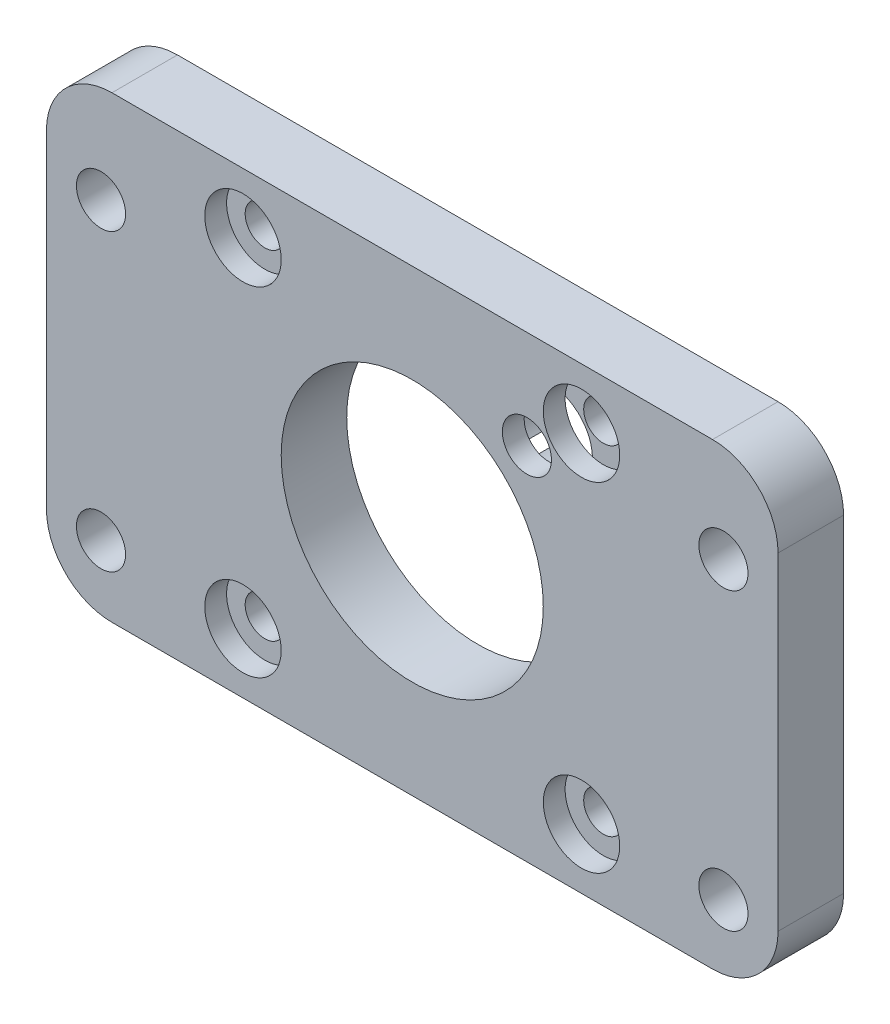
ISO-10303-21;
HEADER;
FILE_DESCRIPTION(('STEP AP214'),'2;1');
FILE_NAME('part.step','',(''),(''),'','','');
FILE_SCHEMA(('AUTOMOTIVE_DESIGN { 1 0 10303 214 1 1 1 1 }'));
ENDSEC;
DATA;
#1=APPLICATION_CONTEXT('core data for automotive mechanical design processes');
#2=APPLICATION_PROTOCOL_DEFINITION('international standard','automotive_design',2000,#1);
#3=PRODUCT_CONTEXT('',#1,'mechanical');
#4=PRODUCT('Part','Part','',(#3));
#5=PRODUCT_RELATED_PRODUCT_CATEGORY('part','',(#4));
#6=PRODUCT_DEFINITION_FORMATION('','',#4);
#7=PRODUCT_DEFINITION_CONTEXT('part definition',#1,'design');
#8=PRODUCT_DEFINITION('design','',#6,#7);
#9=PRODUCT_DEFINITION_SHAPE('','',#8);
#10=(LENGTH_UNIT() NAMED_UNIT(*) SI_UNIT(.MILLI.,.METRE.));
#11=(NAMED_UNIT(*) PLANE_ANGLE_UNIT() SI_UNIT($,.RADIAN.));
#12=(NAMED_UNIT(*) SI_UNIT($,.STERADIAN.) SOLID_ANGLE_UNIT());
#13=UNCERTAINTY_MEASURE_WITH_UNIT(LENGTH_MEASURE(1.E-05),#10,'distance_accuracy_value','');
#14=(GEOMETRIC_REPRESENTATION_CONTEXT(3) GLOBAL_UNCERTAINTY_ASSIGNED_CONTEXT((#13)) GLOBAL_UNIT_ASSIGNED_CONTEXT((#10,
#11,#12)) REPRESENTATION_CONTEXT('',''));
#15=CARTESIAN_POINT('',(0.,0.,0.));
#16=DIRECTION('',(0.,0.,1.));
#17=DIRECTION('',(1.,0.,0.));
#18=AXIS2_PLACEMENT_3D('',#15,#16,#17);
#19=CARTESIAN_POINT('',(49.,36.5,10.));
#20=DIRECTION('',(0.,0.,-1.));
#21=DIRECTION('',(-1.,0.,0.));
#22=AXIS2_PLACEMENT_3D('',#19,#20,#21);
#23=CYLINDRICAL_SURFACE('',#22,1.8);
#24=CARTESIAN_POINT('',(49.,36.5,0.));
#25=DIRECTION('',(0.,0.,-1.));
#26=DIRECTION('',(-1.,0.,0.));
#27=AXIS2_PLACEMENT_3D('',#24,#25,#26);
#28=CIRCLE('',#27,1.8);
#29=CARTESIAN_POINT('',(47.2,36.5,0.));
#30=VERTEX_POINT('',#29);
#31=EDGE_CURVE('E160',#30,#30,#28,.T.);
#32=ORIENTED_EDGE('',*,*,#31,.T.);
#33=EDGE_LOOP('',(#32));
#34=FACE_BOUND('',#33,.T.);
#35=CARTESIAN_POINT('',(49.,36.5,4.));
#36=DIRECTION('',(0.,0.,1.));
#37=DIRECTION('',(1.,0.,0.));
#38=AXIS2_PLACEMENT_3D('',#35,#36,#37);
#39=CIRCLE('',#38,1.8);
#40=CARTESIAN_POINT('',(50.8,36.5,4.));
#41=VERTEX_POINT('',#40);
#42=EDGE_CURVE('E37',#41,#41,#39,.F.);
#43=ORIENTED_EDGE('',*,*,#42,.F.);
#44=EDGE_LOOP('',(#43));
#45=FACE_BOUND('',#44,.T.);
#46=ADVANCED_FACE('F33',(#34,#45),#23,.F.);
#47=CARTESIAN_POINT('',(49.,5.49999999999999,10.));
#48=DIRECTION('',(0.,0.,-1.));
#49=DIRECTION('',(-1.,0.,0.));
#50=AXIS2_PLACEMENT_3D('',#47,#48,#49);
#51=CYLINDRICAL_SURFACE('',#50,1.8);
#52=CARTESIAN_POINT('',(49.,5.49999999999999,0.));
#53=DIRECTION('',(0.,0.,-1.));
#54=DIRECTION('',(-1.,0.,0.));
#55=AXIS2_PLACEMENT_3D('',#52,#53,#54);
#56=CIRCLE('',#55,1.8);
#57=CARTESIAN_POINT('',(47.2,5.49999999999999,0.));
#58=VERTEX_POINT('',#57);
#59=EDGE_CURVE('E157',#58,#58,#56,.T.);
#60=ORIENTED_EDGE('',*,*,#59,.T.);
#61=EDGE_LOOP('',(#60));
#62=FACE_BOUND('',#61,.T.);
#63=CARTESIAN_POINT('',(49.,5.49999999999999,4.));
#64=DIRECTION('',(0.,0.,1.));
#65=DIRECTION('',(1.,0.,0.));
#66=AXIS2_PLACEMENT_3D('',#63,#64,#65);
#67=CIRCLE('',#66,1.8);
#68=CARTESIAN_POINT('',(50.8,5.49999999999999,4.));
#69=VERTEX_POINT('',#68);
#70=EDGE_CURVE('E252',#69,#69,#67,.F.);
#71=ORIENTED_EDGE('',*,*,#70,.F.);
#72=EDGE_LOOP('',(#71));
#73=FACE_BOUND('',#72,.T.);
#74=ADVANCED_FACE('F261',(#62,#73),#51,.F.);
#75=CARTESIAN_POINT('',(18.,36.5,10.));
#76=DIRECTION('',(0.,0.,-1.));
#77=DIRECTION('',(-1.,0.,0.));
#78=AXIS2_PLACEMENT_3D('',#75,#76,#77);
#79=CYLINDRICAL_SURFACE('',#78,1.8);
#80=CARTESIAN_POINT('',(18.,36.5,0.));
#81=DIRECTION('',(0.,0.,-1.));
#82=DIRECTION('',(-1.,0.,0.));
#83=AXIS2_PLACEMENT_3D('',#80,#81,#82);
#84=CIRCLE('',#83,1.8);
#85=CARTESIAN_POINT('',(16.2,36.5,0.));
#86=VERTEX_POINT('',#85);
#87=EDGE_CURVE('E150',#86,#86,#84,.T.);
#88=ORIENTED_EDGE('',*,*,#87,.T.);
#89=EDGE_LOOP('',(#88));
#90=FACE_BOUND('',#89,.T.);
#91=CARTESIAN_POINT('',(18.,36.5,4.));
#92=DIRECTION('',(0.,0.,1.));
#93=DIRECTION('',(1.,0.,0.));
#94=AXIS2_PLACEMENT_3D('',#91,#92,#93);
#95=CIRCLE('',#94,1.8);
#96=CARTESIAN_POINT('',(19.8,36.5,4.));
#97=VERTEX_POINT('',#96);
#98=EDGE_CURVE('E250',#97,#97,#95,.F.);
#99=ORIENTED_EDGE('',*,*,#98,.F.);
#100=EDGE_LOOP('',(#99));
#101=FACE_BOUND('',#100,.T.);
#102=ADVANCED_FACE('F267',(#90,#101),#79,.F.);
#103=CARTESIAN_POINT('',(18.,5.49999999999999,10.));
#104=DIRECTION('',(0.,0.,-1.));
#105=DIRECTION('',(-1.,0.,0.));
#106=AXIS2_PLACEMENT_3D('',#103,#104,#105);
#107=CYLINDRICAL_SURFACE('',#106,1.8);
#108=CARTESIAN_POINT('',(18.,5.49999999999999,0.));
#109=DIRECTION('',(0.,0.,-1.));
#110=DIRECTION('',(-1.,0.,0.));
#111=AXIS2_PLACEMENT_3D('',#108,#109,#110);
#112=CIRCLE('',#111,1.8);
#113=CARTESIAN_POINT('',(16.2,5.49999999999999,0.));
#114=VERTEX_POINT('',#113);
#115=EDGE_CURVE('E154',#114,#114,#112,.T.);
#116=ORIENTED_EDGE('',*,*,#115,.T.);
#117=EDGE_LOOP('',(#116));
#118=FACE_BOUND('',#117,.T.);
#119=CARTESIAN_POINT('',(18.,5.49999999999999,4.));
#120=DIRECTION('',(0.,0.,1.));
#121=DIRECTION('',(1.,0.,0.));
#122=AXIS2_PLACEMENT_3D('',#119,#120,#121);
#123=CIRCLE('',#122,1.8);
#124=CARTESIAN_POINT('',(19.8,5.49999999999999,4.));
#125=VERTEX_POINT('',#124);
#126=EDGE_CURVE('E146',#125,#125,#123,.F.);
#127=ORIENTED_EDGE('',*,*,#126,.F.);
#128=EDGE_LOOP('',(#127));
#129=FACE_BOUND('',#128,.T.);
#130=ADVANCED_FACE('F317',(#118,#129),#107,.F.);
#131=CARTESIAN_POINT('',(0.,0.,6.));
#132=DIRECTION('',(1.,0.,0.));
#133=DIRECTION('',(0.,0.,-1.));
#134=AXIS2_PLACEMENT_3D('',#131,#132,#133);
#135=PLANE('',#134);
#136=DIRECTION('',(0.,-1.,0.));
#137=VECTOR('',#136,1.);
#138=CARTESIAN_POINT('',(0.,0.,0.));
#139=LINE('',#138,#137);
#140=CARTESIAN_POINT('',(0.,36.,0.));
#141=VERTEX_POINT('',#140);
#142=CARTESIAN_POINT('',(0.,6.,0.));
#143=VERTEX_POINT('',#142);
#144=EDGE_CURVE('E192',#141,#143,#139,.T.);
#145=ORIENTED_EDGE('',*,*,#144,.T.);
#146=DIRECTION('',(0.,0.,-1.));
#147=VECTOR('',#146,1.);
#148=CARTESIAN_POINT('',(0.,6.,6.));
#149=LINE('',#148,#147);
#150=CARTESIAN_POINT('',(0.,6.,6.));
#151=VERTEX_POINT('',#150);
#152=EDGE_CURVE('E232',#143,#151,#149,.F.);
#153=ORIENTED_EDGE('',*,*,#152,.T.);
#154=DIRECTION('',(0.,-1.,0.));
#155=VECTOR('',#154,1.);
#156=CARTESIAN_POINT('',(0.,0.,6.));
#157=LINE('',#156,#155);
#158=CARTESIAN_POINT('',(0.,36.,6.));
#159=VERTEX_POINT('',#158);
#160=EDGE_CURVE('E193',#159,#151,#157,.T.);
#161=ORIENTED_EDGE('',*,*,#160,.F.);
#162=DIRECTION('',(0.,0.,-1.));
#163=VECTOR('',#162,1.);
#164=CARTESIAN_POINT('',(0.,36.,6.));
#165=LINE('',#164,#163);
#166=EDGE_CURVE('E229',#159,#141,#165,.T.);
#167=ORIENTED_EDGE('',*,*,#166,.T.);
#168=EDGE_LOOP('',(#145,#153,#161,#167));
#169=FACE_BOUND('',#168,.T.);
#170=ADVANCED_FACE('F313',(#169),#135,.F.);
#171=CARTESIAN_POINT('',(0.,0.,6.));
#172=DIRECTION('',(0.,1.,0.));
#173=DIRECTION('',(0.,0.,1.));
#174=AXIS2_PLACEMENT_3D('',#171,#172,#173);
#175=PLANE('',#174);
#176=DIRECTION('',(1.,0.,0.));
#177=VECTOR('',#176,1.);
#178=CARTESIAN_POINT('',(0.,0.,6.));
#179=LINE('',#178,#177);
#180=CARTESIAN_POINT('',(6.,0.,6.));
#181=VERTEX_POINT('',#180);
#182=CARTESIAN_POINT('',(61.,0.,6.));
#183=VERTEX_POINT('',#182);
#184=EDGE_CURVE('E196',#181,#183,#179,.T.);
#185=ORIENTED_EDGE('',*,*,#184,.F.);
#186=DIRECTION('',(0.,0.,-1.));
#187=VECTOR('',#186,1.);
#188=CARTESIAN_POINT('',(6.,0.,6.));
#189=LINE('',#188,#187);
#190=CARTESIAN_POINT('',(6.,0.,0.));
#191=VERTEX_POINT('',#190);
#192=EDGE_CURVE('E218',#181,#191,#189,.T.);
#193=ORIENTED_EDGE('',*,*,#192,.T.);
#194=DIRECTION('',(1.,0.,0.));
#195=VECTOR('',#194,1.);
#196=CARTESIAN_POINT('',(0.,0.,0.));
#197=LINE('',#196,#195);
#198=CARTESIAN_POINT('',(61.,0.,0.));
#199=VERTEX_POINT('',#198);
#200=EDGE_CURVE('E209',#191,#199,#197,.T.);
#201=ORIENTED_EDGE('',*,*,#200,.T.);
#202=DIRECTION('',(0.,0.,-1.));
#203=VECTOR('',#202,1.);
#204=CARTESIAN_POINT('',(61.,0.,6.));
#205=LINE('',#204,#203);
#206=EDGE_CURVE('E206',#199,#183,#205,.F.);
#207=ORIENTED_EDGE('',*,*,#206,.T.);
#208=EDGE_LOOP('',(#185,#193,#201,#207));
#209=FACE_BOUND('',#208,.T.);
#210=ADVANCED_FACE('F309',(#209),#175,.F.);
#211=CARTESIAN_POINT('',(67.,0.,6.));
#212=DIRECTION('',(-1.,0.,0.));
#213=DIRECTION('',(0.,0.,1.));
#214=AXIS2_PLACEMENT_3D('',#211,#212,#213);
#215=PLANE('',#214);
#216=DIRECTION('',(0.,1.,0.));
#217=VECTOR('',#216,1.);
#218=CARTESIAN_POINT('',(67.,0.,6.));
#219=LINE('',#218,#217);
#220=CARTESIAN_POINT('',(67.,6.,6.));
#221=VERTEX_POINT('',#220);
#222=CARTESIAN_POINT('',(67.,36.,6.));
#223=VERTEX_POINT('',#222);
#224=EDGE_CURVE('E200',#221,#223,#219,.T.);
#225=ORIENTED_EDGE('',*,*,#224,.F.);
#226=DIRECTION('',(0.,0.,-1.));
#227=VECTOR('',#226,1.);
#228=CARTESIAN_POINT('',(67.,6.,6.));
#229=LINE('',#228,#227);
#230=CARTESIAN_POINT('',(67.,6.,0.));
#231=VERTEX_POINT('',#230);
#232=EDGE_CURVE('E11',#221,#231,#229,.T.);
#233=ORIENTED_EDGE('',*,*,#232,.T.);
#234=DIRECTION('',(0.,1.,0.));
#235=VECTOR('',#234,1.);
#236=CARTESIAN_POINT('',(67.,0.,0.));
#237=LINE('',#236,#235);
#238=CARTESIAN_POINT('',(67.,36.,0.));
#239=VERTEX_POINT('',#238);
#240=EDGE_CURVE('E212',#231,#239,#237,.T.);
#241=ORIENTED_EDGE('',*,*,#240,.T.);
#242=DIRECTION('',(0.,0.,-1.));
#243=VECTOR('',#242,1.);
#244=CARTESIAN_POINT('',(67.,36.,6.));
#245=LINE('',#244,#243);
#246=EDGE_CURVE('E42',#239,#223,#245,.F.);
#247=ORIENTED_EDGE('',*,*,#246,.T.);
#248=EDGE_LOOP('',(#225,#233,#241,#247));
#249=FACE_BOUND('',#248,.T.);
#250=ADVANCED_FACE('F305',(#249),#215,.F.);
#251=CARTESIAN_POINT('',(0.,42.,6.));
#252=DIRECTION('',(0.,-1.,0.));
#253=DIRECTION('',(0.,0.,-1.));
#254=AXIS2_PLACEMENT_3D('',#251,#252,#253);
#255=PLANE('',#254);
#256=DIRECTION('',(-1.,0.,0.));
#257=VECTOR('',#256,1.);
#258=CARTESIAN_POINT('',(0.,42.,0.));
#259=LINE('',#258,#257);
#260=CARTESIAN_POINT('',(61.,42.,0.));
#261=VERTEX_POINT('',#260);
#262=CARTESIAN_POINT('',(6.,42.,0.));
#263=VERTEX_POINT('',#262);
#264=EDGE_CURVE('E197',#261,#263,#259,.T.);
#265=ORIENTED_EDGE('',*,*,#264,.T.);
#266=DIRECTION('',(0.,0.,-1.));
#267=VECTOR('',#266,1.);
#268=CARTESIAN_POINT('',(6.,42.,6.));
#269=LINE('',#268,#267);
#270=CARTESIAN_POINT('',(6.,42.,6.));
#271=VERTEX_POINT('',#270);
#272=EDGE_CURVE('E245',#263,#271,#269,.F.);
#273=ORIENTED_EDGE('',*,*,#272,.T.);
#274=DIRECTION('',(-1.,0.,0.));
#275=VECTOR('',#274,1.);
#276=CARTESIAN_POINT('',(0.,42.,6.));
#277=LINE('',#276,#275);
#278=CARTESIAN_POINT('',(61.,42.,6.));
#279=VERTEX_POINT('',#278);
#280=EDGE_CURVE('E203',#279,#271,#277,.T.);
#281=ORIENTED_EDGE('',*,*,#280,.F.);
#282=DIRECTION('',(0.,0.,-1.));
#283=VECTOR('',#282,1.);
#284=CARTESIAN_POINT('',(61.,42.,6.));
#285=LINE('',#284,#283);
#286=EDGE_CURVE('E242',#279,#261,#285,.T.);
#287=ORIENTED_EDGE('',*,*,#286,.T.);
#288=EDGE_LOOP('',(#265,#273,#281,#287));
#289=FACE_BOUND('',#288,.T.);
#290=ADVANCED_FACE('F298',(#289),#255,.F.);
#291=CARTESIAN_POINT('',(0.,0.,6.));
#292=DIRECTION('',(0.,0.,-1.));
#293=DIRECTION('',(-1.,0.,0.));
#294=AXIS2_PLACEMENT_3D('',#291,#292,#293);
#295=PLANE('',#294);
#296=CARTESIAN_POINT('',(44.,33.,6.));
#297=DIRECTION('',(0.,0.,-1.));
#298=DIRECTION('',(-1.,0.,0.));
#299=AXIS2_PLACEMENT_3D('',#296,#297,#298);
#300=CIRCLE('',#299,2.25);
#301=CARTESIAN_POINT('',(41.75,33.,6.));
#302=VERTEX_POINT('',#301);
#303=EDGE_CURVE('E612',#302,#302,#300,.T.);
#304=ORIENTED_EDGE('',*,*,#303,.T.);
#305=EDGE_LOOP('',(#304));
#306=FACE_BOUND('',#305,.T.);
#307=CARTESIAN_POINT('',(18.,36.5,6.));
#308=DIRECTION('',(0.,0.,1.));
#309=DIRECTION('',(1.,0.,0.));
#310=AXIS2_PLACEMENT_3D('',#307,#308,#309);
#311=CIRCLE('',#310,3.5);
#312=CARTESIAN_POINT('',(21.5,36.5,6.));
#313=VERTEX_POINT('',#312);
#314=EDGE_CURVE('E625',#313,#313,#311,.T.);
#315=ORIENTED_EDGE('',*,*,#314,.F.);
#316=EDGE_LOOP('',(#315));
#317=FACE_BOUND('',#316,.T.);
#318=CARTESIAN_POINT('',(49.,5.49999999999999,6.));
#319=DIRECTION('',(0.,0.,1.));
#320=DIRECTION('',(1.,0.,0.));
#321=AXIS2_PLACEMENT_3D('',#318,#319,#320);
#322=CIRCLE('',#321,3.5);
#323=CARTESIAN_POINT('',(52.5,5.49999999999999,6.));
#324=VERTEX_POINT('',#323);
#325=EDGE_CURVE('E123',#324,#324,#322,.T.);
#326=ORIENTED_EDGE('',*,*,#325,.F.);
#327=EDGE_LOOP('',(#326));
#328=FACE_BOUND('',#327,.T.);
#329=CARTESIAN_POINT('',(49.,36.5,6.));
#330=DIRECTION('',(0.,0.,1.));
#331=DIRECTION('',(1.,0.,0.));
#332=AXIS2_PLACEMENT_3D('',#329,#330,#331);
#333=CIRCLE('',#332,3.5);
#334=CARTESIAN_POINT('',(52.5,36.5,6.));
#335=VERTEX_POINT('',#334);
#336=EDGE_CURVE('E137',#335,#335,#333,.T.);
#337=ORIENTED_EDGE('',*,*,#336,.F.);
#338=EDGE_LOOP('',(#337));
#339=FACE_BOUND('',#338,.T.);
#340=CARTESIAN_POINT('',(18.,5.49999999999999,6.));
#341=DIRECTION('',(0.,0.,1.));
#342=DIRECTION('',(1.,0.,0.));
#343=AXIS2_PLACEMENT_3D('',#340,#341,#342);
#344=CIRCLE('',#343,3.5);
#345=CARTESIAN_POINT('',(21.5,5.49999999999999,6.));
#346=VERTEX_POINT('',#345);
#347=EDGE_CURVE('E147',#346,#346,#344,.T.);
#348=ORIENTED_EDGE('',*,*,#347,.F.);
#349=EDGE_LOOP('',(#348));
#350=FACE_BOUND('',#349,.T.);
#351=CARTESIAN_POINT('',(33.5,21.,6.));
#352=DIRECTION('',(0.,0.,-1.));
#353=DIRECTION('',(-1.,0.,0.));
#354=AXIS2_PLACEMENT_3D('',#351,#352,#353);
#355=CIRCLE('',#354,12.);
#356=CARTESIAN_POINT('',(21.5,21.,6.));
#357=VERTEX_POINT('',#356);
#358=EDGE_CURVE('E165',#357,#357,#355,.T.);
#359=ORIENTED_EDGE('',*,*,#358,.T.);
#360=EDGE_LOOP('',(#359));
#361=FACE_BOUND('',#360,.T.);
#362=CARTESIAN_POINT('',(62.,33.,6.));
#363=DIRECTION('',(0.,0.,-1.));
#364=DIRECTION('',(-1.,0.,0.));
#365=AXIS2_PLACEMENT_3D('',#362,#363,#364);
#366=CIRCLE('',#365,2.25);
#367=CARTESIAN_POINT('',(59.75,33.,6.));
#368=VERTEX_POINT('',#367);
#369=EDGE_CURVE('E183',#368,#368,#366,.T.);
#370=ORIENTED_EDGE('',*,*,#369,.T.);
#371=EDGE_LOOP('',(#370));
#372=FACE_BOUND('',#371,.T.);
#373=CARTESIAN_POINT('',(5.,6.,6.));
#374=DIRECTION('',(0.,0.,-1.));
#375=DIRECTION('',(-1.,0.,0.));
#376=AXIS2_PLACEMENT_3D('',#373,#374,#375);
#377=CIRCLE('',#376,2.25);
#378=CARTESIAN_POINT('',(2.75,6.,6.));
#379=VERTEX_POINT('',#378);
#380=EDGE_CURVE('E180',#379,#379,#377,.T.);
#381=ORIENTED_EDGE('',*,*,#380,.T.);
#382=EDGE_LOOP('',(#381));
#383=FACE_BOUND('',#382,.T.);
#384=CARTESIAN_POINT('',(5.,33.,6.));
#385=DIRECTION('',(0.,0.,-1.));
#386=DIRECTION('',(-1.,0.,0.));
#387=AXIS2_PLACEMENT_3D('',#384,#385,#386);
#388=CIRCLE('',#387,2.25);
#389=CARTESIAN_POINT('',(2.74999999999999,33.,6.));
#390=VERTEX_POINT('',#389);
#391=EDGE_CURVE('E172',#390,#390,#388,.T.);
#392=ORIENTED_EDGE('',*,*,#391,.T.);
#393=EDGE_LOOP('',(#392));
#394=FACE_BOUND('',#393,.T.);
#395=CARTESIAN_POINT('',(62.,6.,6.));
#396=DIRECTION('',(0.,0.,-1.));
#397=DIRECTION('',(-1.,0.,0.));
#398=AXIS2_PLACEMENT_3D('',#395,#396,#397);
#399=CIRCLE('',#398,2.25);
#400=CARTESIAN_POINT('',(59.75,6.,6.));
#401=VERTEX_POINT('',#400);
#402=EDGE_CURVE('E189',#401,#401,#399,.T.);
#403=ORIENTED_EDGE('',*,*,#402,.T.);
#404=EDGE_LOOP('',(#403));
#405=FACE_BOUND('',#404,.T.);
#406=ORIENTED_EDGE('',*,*,#160,.T.);
#407=CARTESIAN_POINT('',(6.,6.,6.));
#408=DIRECTION('',(0.,0.,-1.));
#409=DIRECTION('',(-1.,0.,0.));
#410=AXIS2_PLACEMENT_3D('',#407,#408,#409);
#411=CIRCLE('',#410,6.);
#412=EDGE_CURVE('E240',#151,#181,#411,.F.);
#413=ORIENTED_EDGE('',*,*,#412,.T.);
#414=ORIENTED_EDGE('',*,*,#184,.T.);
#415=CARTESIAN_POINT('',(61.,6.,6.));
#416=DIRECTION('',(0.,0.,-1.));
#417=DIRECTION('',(-1.,0.,0.));
#418=AXIS2_PLACEMENT_3D('',#415,#416,#417);
#419=CIRCLE('',#418,6.);
#420=EDGE_CURVE('E236',#183,#221,#419,.F.);
#421=ORIENTED_EDGE('',*,*,#420,.T.);
#422=ORIENTED_EDGE('',*,*,#224,.T.);
#423=CARTESIAN_POINT('',(61.,36.,6.));
#424=DIRECTION('',(0.,0.,-1.));
#425=DIRECTION('',(-1.,0.,0.));
#426=AXIS2_PLACEMENT_3D('',#423,#424,#425);
#427=CIRCLE('',#426,6.);
#428=EDGE_CURVE('E234',#223,#279,#427,.F.);
#429=ORIENTED_EDGE('',*,*,#428,.T.);
#430=ORIENTED_EDGE('',*,*,#280,.T.);
#431=CARTESIAN_POINT('',(6.,36.,6.));
#432=DIRECTION('',(0.,0.,-1.));
#433=DIRECTION('',(-1.,0.,0.));
#434=AXIS2_PLACEMENT_3D('',#431,#432,#433);
#435=CIRCLE('',#434,6.);
#436=EDGE_CURVE('E238',#271,#159,#435,.F.);
#437=ORIENTED_EDGE('',*,*,#436,.T.);
#438=EDGE_LOOP('',(#406,#413,#414,#421,#422,#429,#430,#437));
#439=FACE_BOUND('',#438,.T.);
#440=ADVANCED_FACE('F295',(#306,#317,#328,#339,#350,#361,#372,#383,#394,#405,#439),#295,.F.);
#441=CARTESIAN_POINT('',(0.,0.,0.));
#442=DIRECTION('',(0.,0.,-1.));
#443=DIRECTION('',(-1.,0.,0.));
#444=AXIS2_PLACEMENT_3D('',#441,#442,#443);
#445=PLANE('',#444);
#446=CARTESIAN_POINT('',(44.,33.,0.));
#447=DIRECTION('',(0.,0.,-1.));
#448=DIRECTION('',(-1.,0.,0.));
#449=AXIS2_PLACEMENT_3D('',#446,#447,#448);
#450=CIRCLE('',#449,4.00000000000001);
#451=CARTESIAN_POINT('',(40.9624702059921,30.3974219030902,0.));
#452=VERTEX_POINT('',#451);
#453=CARTESIAN_POINT('',(41.8236654872232,29.643876032013,0.));
#454=VERTEX_POINT('',#453);
#455=EDGE_CURVE('E613',#452,#454,#450,.T.);
#456=ORIENTED_EDGE('',*,*,#455,.F.);
#457=CARTESIAN_POINT('',(33.5,21.,0.));
#458=DIRECTION('',(0.,0.,-1.));
#459=DIRECTION('',(-1.,0.,0.));
#460=AXIS2_PLACEMENT_3D('',#457,#458,#459);
#461=CIRCLE('',#460,12.);
#462=EDGE_CURVE('E153',#454,#452,#461,.T.);
#463=ORIENTED_EDGE('',*,*,#462,.F.);
#464=EDGE_LOOP('',(#456,#463));
#465=FACE_BOUND('',#464,.T.);
#466=ORIENTED_EDGE('',*,*,#87,.F.);
#467=EDGE_LOOP('',(#466));
#468=FACE_BOUND('',#467,.T.);
#469=ORIENTED_EDGE('',*,*,#115,.F.);
#470=EDGE_LOOP('',(#469));
#471=FACE_BOUND('',#470,.T.);
#472=ORIENTED_EDGE('',*,*,#59,.F.);
#473=EDGE_LOOP('',(#472));
#474=FACE_BOUND('',#473,.T.);
#475=ORIENTED_EDGE('',*,*,#31,.F.);
#476=EDGE_LOOP('',(#475));
#477=FACE_BOUND('',#476,.T.);
#478=CARTESIAN_POINT('',(62.,33.,0.));
#479=DIRECTION('',(0.,0.,-1.));
#480=DIRECTION('',(-1.,0.,0.));
#481=AXIS2_PLACEMENT_3D('',#478,#479,#480);
#482=CIRCLE('',#481,2.25);
#483=CARTESIAN_POINT('',(59.75,33.,0.));
#484=VERTEX_POINT('',#483);
#485=EDGE_CURVE('E169',#484,#484,#482,.T.);
#486=ORIENTED_EDGE('',*,*,#485,.F.);
#487=EDGE_LOOP('',(#486));
#488=FACE_BOUND('',#487,.T.);
#489=CARTESIAN_POINT('',(5.,6.,0.));
#490=DIRECTION('',(0.,0.,-1.));
#491=DIRECTION('',(-1.,0.,0.));
#492=AXIS2_PLACEMENT_3D('',#489,#490,#491);
#493=CIRCLE('',#492,2.25);
#494=CARTESIAN_POINT('',(2.75,6.,0.));
#495=VERTEX_POINT('',#494);
#496=EDGE_CURVE('E173',#495,#495,#493,.T.);
#497=ORIENTED_EDGE('',*,*,#496,.F.);
#498=EDGE_LOOP('',(#497));
#499=FACE_BOUND('',#498,.T.);
#500=CARTESIAN_POINT('',(5.,33.,0.));
#501=DIRECTION('',(0.,0.,-1.));
#502=DIRECTION('',(-1.,0.,0.));
#503=AXIS2_PLACEMENT_3D('',#500,#501,#502);
#504=CIRCLE('',#503,2.25);
#505=CARTESIAN_POINT('',(2.74999999999999,33.,0.));
#506=VERTEX_POINT('',#505);
#507=EDGE_CURVE('E168',#506,#506,#504,.T.);
#508=ORIENTED_EDGE('',*,*,#507,.F.);
#509=EDGE_LOOP('',(#508));
#510=FACE_BOUND('',#509,.T.);
#511=CARTESIAN_POINT('',(62.,6.,0.));
#512=DIRECTION('',(0.,0.,-1.));
#513=DIRECTION('',(-1.,0.,0.));
#514=AXIS2_PLACEMENT_3D('',#511,#512,#513);
#515=CIRCLE('',#514,2.25);
#516=CARTESIAN_POINT('',(59.75,6.,0.));
#517=VERTEX_POINT('',#516);
#518=EDGE_CURVE('E186',#517,#517,#515,.T.);
#519=ORIENTED_EDGE('',*,*,#518,.F.);
#520=EDGE_LOOP('',(#519));
#521=FACE_BOUND('',#520,.T.);
#522=ORIENTED_EDGE('',*,*,#200,.F.);
#523=CARTESIAN_POINT('',(6.,6.,0.));
#524=DIRECTION('',(0.,0.,-1.));
#525=DIRECTION('',(-1.,0.,0.));
#526=AXIS2_PLACEMENT_3D('',#523,#524,#525);
#527=CIRCLE('',#526,6.);
#528=EDGE_CURVE('E227',#191,#143,#527,.T.);
#529=ORIENTED_EDGE('',*,*,#528,.T.);
#530=ORIENTED_EDGE('',*,*,#144,.F.);
#531=CARTESIAN_POINT('',(6.,36.,0.));
#532=DIRECTION('',(0.,0.,-1.));
#533=DIRECTION('',(-1.,0.,0.));
#534=AXIS2_PLACEMENT_3D('',#531,#532,#533);
#535=CIRCLE('',#534,6.);
#536=EDGE_CURVE('E225',#141,#263,#535,.T.);
#537=ORIENTED_EDGE('',*,*,#536,.T.);
#538=ORIENTED_EDGE('',*,*,#264,.F.);
#539=CARTESIAN_POINT('',(61.,36.,0.));
#540=DIRECTION('',(0.,0.,-1.));
#541=DIRECTION('',(-1.,0.,0.));
#542=AXIS2_PLACEMENT_3D('',#539,#540,#541);
#543=CIRCLE('',#542,6.);
#544=EDGE_CURVE('E221',#261,#239,#543,.T.);
#545=ORIENTED_EDGE('',*,*,#544,.T.);
#546=ORIENTED_EDGE('',*,*,#240,.F.);
#547=CARTESIAN_POINT('',(61.,6.,0.));
#548=DIRECTION('',(0.,0.,-1.));
#549=DIRECTION('',(-1.,0.,0.));
#550=AXIS2_PLACEMENT_3D('',#547,#548,#549);
#551=CIRCLE('',#550,6.);
#552=EDGE_CURVE('E223',#231,#199,#551,.T.);
#553=ORIENTED_EDGE('',*,*,#552,.T.);
#554=EDGE_LOOP('',(#522,#529,#530,#537,#538,#545,#546,#553));
#555=FACE_BOUND('',#554,.T.);
#556=ADVANCED_FACE('F293',(#465,#468,#471,#474,#477,#488,#499,#510,#521,#555),#445,.T.);
#557=CARTESIAN_POINT('',(62.,6.,9.));
#558=DIRECTION('',(0.,0.,-1.));
#559=DIRECTION('',(-1.,0.,0.));
#560=AXIS2_PLACEMENT_3D('',#557,#558,#559);
#561=CYLINDRICAL_SURFACE('',#560,2.25);
#562=ORIENTED_EDGE('',*,*,#518,.T.);
#563=EDGE_LOOP('',(#562));
#564=FACE_BOUND('',#563,.T.);
#565=ORIENTED_EDGE('',*,*,#402,.F.);
#566=EDGE_LOOP('',(#565));
#567=FACE_BOUND('',#566,.T.);
#568=ADVANCED_FACE('F289',(#564,#567),#561,.F.);
#569=CARTESIAN_POINT('',(5.,33.,9.));
#570=DIRECTION('',(0.,0.,-1.));
#571=DIRECTION('',(-1.,0.,0.));
#572=AXIS2_PLACEMENT_3D('',#569,#570,#571);
#573=CYLINDRICAL_SURFACE('',#572,2.25);
#574=ORIENTED_EDGE('',*,*,#507,.T.);
#575=EDGE_LOOP('',(#574));
#576=FACE_BOUND('',#575,.T.);
#577=ORIENTED_EDGE('',*,*,#391,.F.);
#578=EDGE_LOOP('',(#577));
#579=FACE_BOUND('',#578,.T.);
#580=ADVANCED_FACE('F285',(#576,#579),#573,.F.);
#581=CARTESIAN_POINT('',(5.,6.,9.));
#582=DIRECTION('',(0.,0.,-1.));
#583=DIRECTION('',(-1.,0.,0.));
#584=AXIS2_PLACEMENT_3D('',#581,#582,#583);
#585=CYLINDRICAL_SURFACE('',#584,2.25);
#586=ORIENTED_EDGE('',*,*,#496,.T.);
#587=EDGE_LOOP('',(#586));
#588=FACE_BOUND('',#587,.T.);
#589=ORIENTED_EDGE('',*,*,#380,.F.);
#590=EDGE_LOOP('',(#589));
#591=FACE_BOUND('',#590,.T.);
#592=ADVANCED_FACE('F281',(#588,#591),#585,.F.);
#593=CARTESIAN_POINT('',(62.,33.,9.));
#594=DIRECTION('',(0.,0.,-1.));
#595=DIRECTION('',(-1.,0.,0.));
#596=AXIS2_PLACEMENT_3D('',#593,#594,#595);
#597=CYLINDRICAL_SURFACE('',#596,2.25);
#598=ORIENTED_EDGE('',*,*,#485,.T.);
#599=EDGE_LOOP('',(#598));
#600=FACE_BOUND('',#599,.T.);
#601=ORIENTED_EDGE('',*,*,#369,.F.);
#602=EDGE_LOOP('',(#601));
#603=FACE_BOUND('',#602,.T.);
#604=ADVANCED_FACE('F277',(#600,#603),#597,.F.);
#605=CARTESIAN_POINT('',(6.,6.,6.));
#606=DIRECTION('',(0.,0.,-1.));
#607=DIRECTION('',(-1.,0.,0.));
#608=AXIS2_PLACEMENT_3D('',#605,#606,#607);
#609=CYLINDRICAL_SURFACE('',#608,6.);
#610=ORIENTED_EDGE('',*,*,#412,.F.);
#611=ORIENTED_EDGE('',*,*,#152,.F.);
#612=ORIENTED_EDGE('',*,*,#528,.F.);
#613=ORIENTED_EDGE('',*,*,#192,.F.);
#614=EDGE_LOOP('',(#610,#611,#612,#613));
#615=FACE_BOUND('',#614,.T.);
#616=ADVANCED_FACE('F280',(#615),#609,.T.);
#617=CARTESIAN_POINT('',(6.,36.,6.));
#618=DIRECTION('',(0.,0.,-1.));
#619=DIRECTION('',(-1.,0.,0.));
#620=AXIS2_PLACEMENT_3D('',#617,#618,#619);
#621=CYLINDRICAL_SURFACE('',#620,6.);
#622=ORIENTED_EDGE('',*,*,#436,.F.);
#623=ORIENTED_EDGE('',*,*,#272,.F.);
#624=ORIENTED_EDGE('',*,*,#536,.F.);
#625=ORIENTED_EDGE('',*,*,#166,.F.);
#626=EDGE_LOOP('',(#622,#623,#624,#625));
#627=FACE_BOUND('',#626,.T.);
#628=ADVANCED_FACE('F321',(#627),#621,.T.);
#629=CARTESIAN_POINT('',(61.,6.,6.));
#630=DIRECTION('',(0.,0.,-1.));
#631=DIRECTION('',(-1.,0.,0.));
#632=AXIS2_PLACEMENT_3D('',#629,#630,#631);
#633=CYLINDRICAL_SURFACE('',#632,6.);
#634=ORIENTED_EDGE('',*,*,#420,.F.);
#635=ORIENTED_EDGE('',*,*,#206,.F.);
#636=ORIENTED_EDGE('',*,*,#552,.F.);
#637=ORIENTED_EDGE('',*,*,#232,.F.);
#638=EDGE_LOOP('',(#634,#635,#636,#637));
#639=FACE_BOUND('',#638,.T.);
#640=ADVANCED_FACE('F324',(#639),#633,.T.);
#641=CARTESIAN_POINT('',(61.,36.,6.));
#642=DIRECTION('',(0.,0.,-1.));
#643=DIRECTION('',(-1.,0.,0.));
#644=AXIS2_PLACEMENT_3D('',#641,#642,#643);
#645=CYLINDRICAL_SURFACE('',#644,6.);
#646=ORIENTED_EDGE('',*,*,#428,.F.);
#647=ORIENTED_EDGE('',*,*,#246,.F.);
#648=ORIENTED_EDGE('',*,*,#544,.F.);
#649=ORIENTED_EDGE('',*,*,#286,.F.);
#650=EDGE_LOOP('',(#646,#647,#648,#649));
#651=FACE_BOUND('',#650,.T.);
#652=ADVANCED_FACE('F35',(#651),#645,.T.);
#653=CARTESIAN_POINT('',(33.5,21.,10.));
#654=DIRECTION('',(0.,0.,-1.));
#655=DIRECTION('',(-1.,0.,0.));
#656=AXIS2_PLACEMENT_3D('',#653,#654,#655);
#657=CYLINDRICAL_SURFACE('',#656,12.);
#658=CARTESIAN_POINT('',(33.5,21.,4.));
#659=DIRECTION('',(0.,0.,-1.));
#660=DIRECTION('',(-1.,0.,0.));
#661=AXIS2_PLACEMENT_3D('',#658,#659,#660);
#662=CIRCLE('',#661,12.);
#663=CARTESIAN_POINT('',(41.8236654872232,29.643876032013,4.));
#664=VERTEX_POINT('',#663);
#665=CARTESIAN_POINT('',(40.9624702059921,30.3974219030902,4.));
#666=VERTEX_POINT('',#665);
#667=EDGE_CURVE('E134',#664,#666,#662,.F.);
#668=ORIENTED_EDGE('',*,*,#667,.F.);
#669=DIRECTION('',(0.,0.,-1.));
#670=VECTOR('',#669,1.);
#671=CARTESIAN_POINT('',(41.8236654872232,29.643876032013,2.));
#672=LINE('',#671,#670);
#673=EDGE_CURVE('E128',#664,#454,#672,.T.);
#674=ORIENTED_EDGE('',*,*,#673,.T.);
#675=ORIENTED_EDGE('',*,*,#462,.T.);
#676=DIRECTION('',(0.,0.,-1.));
#677=VECTOR('',#676,1.);
#678=CARTESIAN_POINT('',(40.9624702059921,30.3974219030902,2.));
#679=LINE('',#678,#677);
#680=EDGE_CURVE('E619',#452,#666,#679,.F.);
#681=ORIENTED_EDGE('',*,*,#680,.T.);
#682=EDGE_LOOP('',(#668,#674,#675,#681));
#683=FACE_BOUND('',#682,.T.);
#684=ORIENTED_EDGE('',*,*,#358,.F.);
#685=EDGE_LOOP('',(#684));
#686=FACE_BOUND('',#685,.T.);
#687=ADVANCED_FACE('F272',(#683,#686),#657,.F.);
#688=CARTESIAN_POINT('',(18.,5.49999999999999,4.));
#689=DIRECTION('',(0.,0.,1.));
#690=DIRECTION('',(1.,0.,0.));
#691=AXIS2_PLACEMENT_3D('',#688,#689,#690);
#692=PLANE('',#691);
#693=CARTESIAN_POINT('',(18.,5.49999999999999,4.));
#694=DIRECTION('',(0.,0.,1.));
#695=DIRECTION('',(1.,0.,0.));
#696=AXIS2_PLACEMENT_3D('',#693,#694,#695);
#697=CIRCLE('',#696,3.5);
#698=CARTESIAN_POINT('',(21.5,5.49999999999999,4.));
#699=VERTEX_POINT('',#698);
#700=EDGE_CURVE('E143',#699,#699,#697,.T.);
#701=ORIENTED_EDGE('',*,*,#700,.T.);
#702=EDGE_LOOP('',(#701));
#703=FACE_BOUND('',#702,.T.);
#704=ORIENTED_EDGE('',*,*,#126,.T.);
#705=EDGE_LOOP('',(#704));
#706=FACE_BOUND('',#705,.T.);
#707=ADVANCED_FACE('F275',(#703,#706),#692,.T.);
#708=CARTESIAN_POINT('',(18.,5.49999999999999,4.));
#709=DIRECTION('',(0.,0.,1.));
#710=DIRECTION('',(1.,0.,0.));
#711=AXIS2_PLACEMENT_3D('',#708,#709,#710);
#712=CYLINDRICAL_SURFACE('',#711,3.5);
#713=ORIENTED_EDGE('',*,*,#700,.F.);
#714=EDGE_LOOP('',(#713));
#715=FACE_BOUND('',#714,.T.);
#716=ORIENTED_EDGE('',*,*,#347,.T.);
#717=EDGE_LOOP('',(#716));
#718=FACE_BOUND('',#717,.T.);
#719=ADVANCED_FACE('F368',(#715,#718),#712,.F.);
#720=CARTESIAN_POINT('',(18.,36.5,4.));
#721=DIRECTION('',(0.,0.,1.));
#722=DIRECTION('',(1.,0.,0.));
#723=AXIS2_PLACEMENT_3D('',#720,#721,#722);
#724=PLANE('',#723);
#725=CARTESIAN_POINT('',(18.,36.5,4.));
#726=DIRECTION('',(0.,0.,1.));
#727=DIRECTION('',(1.,0.,0.));
#728=AXIS2_PLACEMENT_3D('',#725,#726,#727);
#729=CIRCLE('',#728,3.5);
#730=CARTESIAN_POINT('',(21.5,36.5,4.));
#731=VERTEX_POINT('',#730);
#732=EDGE_CURVE('E253',#731,#731,#729,.T.);
#733=ORIENTED_EDGE('',*,*,#732,.T.);
#734=EDGE_LOOP('',(#733));
#735=FACE_BOUND('',#734,.T.);
#736=ORIENTED_EDGE('',*,*,#98,.T.);
#737=EDGE_LOOP('',(#736));
#738=FACE_BOUND('',#737,.T.);
#739=ADVANCED_FACE('F377',(#735,#738),#724,.T.);
#740=CARTESIAN_POINT('',(18.,36.5,4.));
#741=DIRECTION('',(0.,0.,1.));
#742=DIRECTION('',(1.,0.,0.));
#743=AXIS2_PLACEMENT_3D('',#740,#741,#742);
#744=CYLINDRICAL_SURFACE('',#743,3.5);
#745=ORIENTED_EDGE('',*,*,#732,.F.);
#746=EDGE_LOOP('',(#745));
#747=FACE_BOUND('',#746,.T.);
#748=ORIENTED_EDGE('',*,*,#314,.T.);
#749=EDGE_LOOP('',(#748));
#750=FACE_BOUND('',#749,.T.);
#751=ADVANCED_FACE('F385',(#747,#750),#744,.F.);
#752=CARTESIAN_POINT('',(49.,5.49999999999999,4.));
#753=DIRECTION('',(0.,0.,1.));
#754=DIRECTION('',(1.,0.,0.));
#755=AXIS2_PLACEMENT_3D('',#752,#753,#754);
#756=PLANE('',#755);
#757=CARTESIAN_POINT('',(49.,5.49999999999999,4.));
#758=DIRECTION('',(0.,0.,1.));
#759=DIRECTION('',(1.,0.,0.));
#760=AXIS2_PLACEMENT_3D('',#757,#758,#759);
#761=CIRCLE('',#760,3.5);
#762=CARTESIAN_POINT('',(52.5,5.49999999999999,4.));
#763=VERTEX_POINT('',#762);
#764=EDGE_CURVE('E627',#763,#763,#761,.T.);
#765=ORIENTED_EDGE('',*,*,#764,.T.);
#766=EDGE_LOOP('',(#765));
#767=FACE_BOUND('',#766,.T.);
#768=ORIENTED_EDGE('',*,*,#70,.T.);
#769=EDGE_LOOP('',(#768));
#770=FACE_BOUND('',#769,.T.);
#771=ADVANCED_FACE('F393',(#767,#770),#756,.T.);
#772=CARTESIAN_POINT('',(49.,5.49999999999999,4.));
#773=DIRECTION('',(0.,0.,1.));
#774=DIRECTION('',(1.,0.,0.));
#775=AXIS2_PLACEMENT_3D('',#772,#773,#774);
#776=CYLINDRICAL_SURFACE('',#775,3.5);
#777=ORIENTED_EDGE('',*,*,#764,.F.);
#778=EDGE_LOOP('',(#777));
#779=FACE_BOUND('',#778,.T.);
#780=ORIENTED_EDGE('',*,*,#325,.T.);
#781=EDGE_LOOP('',(#780));
#782=FACE_BOUND('',#781,.T.);
#783=ADVANCED_FACE('F401',(#779,#782),#776,.F.);
#784=CARTESIAN_POINT('',(49.,36.5,4.));
#785=DIRECTION('',(0.,0.,1.));
#786=DIRECTION('',(1.,0.,0.));
#787=AXIS2_PLACEMENT_3D('',#784,#785,#786);
#788=PLANE('',#787);
#789=CARTESIAN_POINT('',(44.,33.,4.));
#790=DIRECTION('',(0.,0.,-1.));
#791=DIRECTION('',(-1.,0.,0.));
#792=AXIS2_PLACEMENT_3D('',#789,#790,#791);
#793=CIRCLE('',#792,4.00000000000001);
#794=CARTESIAN_POINT('',(45.5060467773834,36.7056474608809,4.));
#795=VERTEX_POINT('',#794);
#796=CARTESIAN_POINT('',(47.9973089273146,33.1467015324077,4.));
#797=VERTEX_POINT('',#796);
#798=EDGE_CURVE('E57',#795,#797,#793,.T.);
#799=ORIENTED_EDGE('',*,*,#798,.T.);
#800=CARTESIAN_POINT('',(49.,36.5,4.));
#801=DIRECTION('',(0.,0.,1.));
#802=DIRECTION('',(1.,0.,0.));
#803=AXIS2_PLACEMENT_3D('',#800,#801,#802);
#804=CIRCLE('',#803,3.5);
#805=EDGE_CURVE('E124',#797,#795,#804,.T.);
#806=ORIENTED_EDGE('',*,*,#805,.T.);
#807=EDGE_LOOP('',(#799,#806));
#808=FACE_BOUND('',#807,.T.);
#809=ORIENTED_EDGE('',*,*,#42,.T.);
#810=EDGE_LOOP('',(#809));
#811=FACE_BOUND('',#810,.T.);
#812=ADVANCED_FACE('F132',(#808,#811),#788,.T.);
#813=CARTESIAN_POINT('',(49.,36.5,4.));
#814=DIRECTION('',(0.,0.,1.));
#815=DIRECTION('',(1.,0.,0.));
#816=AXIS2_PLACEMENT_3D('',#813,#814,#815);
#817=CYLINDRICAL_SURFACE('',#816,3.5);
#818=EDGE_CURVE('E117',#795,#797,#804,.T.);
#819=ORIENTED_EDGE('',*,*,#818,.F.);
#820=ORIENTED_EDGE('',*,*,#805,.F.);
#821=EDGE_LOOP('',(#819,#820));
#822=FACE_BOUND('',#821,.T.);
#823=ORIENTED_EDGE('',*,*,#336,.T.);
#824=EDGE_LOOP('',(#823));
#825=FACE_BOUND('',#824,.T.);
#826=ADVANCED_FACE('F135',(#822,#825),#817,.F.);
#827=CARTESIAN_POINT('',(44.,33.,4.));
#828=DIRECTION('',(0.,0.,-1.));
#829=DIRECTION('',(-1.,0.,0.));
#830=AXIS2_PLACEMENT_3D('',#827,#828,#829);
#831=CYLINDRICAL_SURFACE('',#830,4.00000000000001);
#832=EDGE_CURVE('E50',#797,#664,#793,.T.);
#833=ORIENTED_EDGE('',*,*,#832,.F.);
#834=ORIENTED_EDGE('',*,*,#798,.F.);
#835=EDGE_CURVE('E119',#666,#795,#793,.T.);
#836=ORIENTED_EDGE('',*,*,#835,.F.);
#837=ORIENTED_EDGE('',*,*,#680,.F.);
#838=ORIENTED_EDGE('',*,*,#455,.T.);
#839=ORIENTED_EDGE('',*,*,#673,.F.);
#840=EDGE_LOOP('',(#833,#834,#836,#837,#838,#839));
#841=FACE_BOUND('',#840,.T.);
#842=ADVANCED_FACE('F126',(#841),#831,.F.);
#843=CARTESIAN_POINT('',(44.,33.,4.));
#844=DIRECTION('',(0.,0.,-1.));
#845=DIRECTION('',(-1.,0.,0.));
#846=AXIS2_PLACEMENT_3D('',#843,#844,#845);
#847=PLANE('',#846);
#848=CARTESIAN_POINT('',(44.,33.,4.));
#849=DIRECTION('',(0.,0.,-1.));
#850=DIRECTION('',(-1.,0.,0.));
#851=AXIS2_PLACEMENT_3D('',#848,#849,#850);
#852=CIRCLE('',#851,2.25);
#853=CARTESIAN_POINT('',(41.75,33.,4.));
#854=VERTEX_POINT('',#853);
#855=EDGE_CURVE('E609',#854,#854,#852,.T.);
#856=ORIENTED_EDGE('',*,*,#855,.F.);
#857=EDGE_LOOP('',(#856));
#858=FACE_BOUND('',#857,.T.);
#859=ORIENTED_EDGE('',*,*,#667,.T.);
#860=ORIENTED_EDGE('',*,*,#835,.T.);
#861=ORIENTED_EDGE('',*,*,#818,.T.);
#862=ORIENTED_EDGE('',*,*,#832,.T.);
#863=EDGE_LOOP('',(#859,#860,#861,#862));
#864=FACE_BOUND('',#863,.T.);
#865=ADVANCED_FACE('F118',(#858,#864),#847,.T.);
#866=CARTESIAN_POINT('',(44.,33.,26.));
#867=DIRECTION('',(0.,0.,-1.));
#868=DIRECTION('',(-1.,0.,0.));
#869=AXIS2_PLACEMENT_3D('',#866,#867,#868);
#870=CYLINDRICAL_SURFACE('',#869,2.25);
#871=ORIENTED_EDGE('',*,*,#855,.T.);
#872=EDGE_LOOP('',(#871));
#873=FACE_BOUND('',#872,.T.);
#874=ORIENTED_EDGE('',*,*,#303,.F.);
#875=EDGE_LOOP('',(#874));
#876=FACE_BOUND('',#875,.T.);
#877=ADVANCED_FACE('F433',(#873,#876),#870,.F.);
#878=CLOSED_SHELL('',(#46,#74,#102,#130,#170,#210,#250,#290,#440,#556,#568,#580,#592,#604,#616,
#628,#640,#652,#687,#707,#719,#739,#751,#771,#783,#812,#826,#842,#865,#877));
#879=MANIFOLD_SOLID_BREP('B2',#878);
#880=ADVANCED_BREP_SHAPE_REPRESENTATION('',(#18,#879),#14);
#881=SHAPE_DEFINITION_REPRESENTATION(#9,#880);
ENDSEC;
END-ISO-10303-21;
